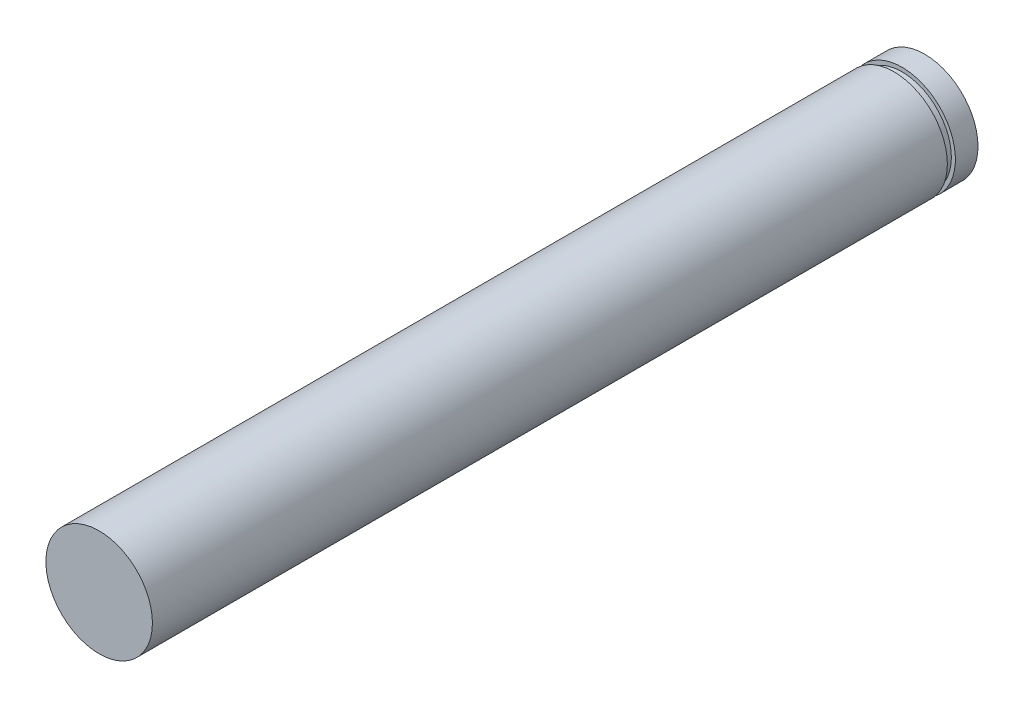
ISO-10303-21;
HEADER;
FILE_DESCRIPTION(('STEP AP214'),'2;1');
FILE_NAME('part.step','',(''),(''),'','','');
FILE_SCHEMA(('AUTOMOTIVE_DESIGN { 1 0 10303 214 1 1 1 1 }'));
ENDSEC;
DATA;
#1=APPLICATION_CONTEXT('core data for automotive mechanical design processes');
#2=APPLICATION_PROTOCOL_DEFINITION('international standard','automotive_design',2000,#1);
#3=PRODUCT_CONTEXT('',#1,'mechanical');
#4=PRODUCT('Part','Part','',(#3));
#5=PRODUCT_RELATED_PRODUCT_CATEGORY('part','',(#4));
#6=PRODUCT_DEFINITION_FORMATION('','',#4);
#7=PRODUCT_DEFINITION_CONTEXT('part definition',#1,'design');
#8=PRODUCT_DEFINITION('design','',#6,#7);
#9=PRODUCT_DEFINITION_SHAPE('','',#8);
#10=(LENGTH_UNIT() NAMED_UNIT(*) SI_UNIT(.MILLI.,.METRE.));
#11=(NAMED_UNIT(*) PLANE_ANGLE_UNIT() SI_UNIT($,.RADIAN.));
#12=(NAMED_UNIT(*) SI_UNIT($,.STERADIAN.) SOLID_ANGLE_UNIT());
#13=UNCERTAINTY_MEASURE_WITH_UNIT(LENGTH_MEASURE(1.E-05),#10,'distance_accuracy_value','');
#14=(GEOMETRIC_REPRESENTATION_CONTEXT(3) GLOBAL_UNCERTAINTY_ASSIGNED_CONTEXT((#13)) GLOBAL_UNIT_ASSIGNED_CONTEXT((#10,
#11,#12)) REPRESENTATION_CONTEXT('',''));
#15=CARTESIAN_POINT('',(0.,0.,0.));
#16=DIRECTION('',(0.,0.,1.));
#17=DIRECTION('',(1.,0.,0.));
#18=AXIS2_PLACEMENT_3D('',#15,#16,#17);
#19=CARTESIAN_POINT('',(0.,0.,62.));
#20=DIRECTION('',(0.,0.,-1.));
#21=DIRECTION('',(-1.,0.,0.));
#22=AXIS2_PLACEMENT_3D('',#19,#20,#21);
#23=CYLINDRICAL_SURFACE('',#22,4.);
#24=CARTESIAN_POINT('',(0.,0.,1.7));
#25=DIRECTION('',(0.,0.,-1.));
#26=DIRECTION('',(-1.,0.,0.));
#27=AXIS2_PLACEMENT_3D('',#24,#25,#26);
#28=CIRCLE('',#27,4.);
#29=CARTESIAN_POINT('',(-4.,0.,1.7));
#30=VERTEX_POINT('',#29);
#31=EDGE_CURVE('E35',#30,#30,#28,.T.);
#32=ORIENTED_EDGE('',*,*,#31,.T.);
#33=EDGE_LOOP('',(#32));
#34=FACE_BOUND('',#33,.T.);
#35=CARTESIAN_POINT('',(0.,0.,0.));
#36=DIRECTION('',(0.,0.,1.));
#37=DIRECTION('',(1.,0.,0.));
#38=AXIS2_PLACEMENT_3D('',#35,#36,#37);
#39=CIRCLE('',#38,4.);
#40=CARTESIAN_POINT('',(4.,0.,0.));
#41=VERTEX_POINT('',#40);
#42=EDGE_CURVE('E39',#41,#41,#39,.T.);
#43=ORIENTED_EDGE('',*,*,#42,.T.);
#44=EDGE_LOOP('',(#43));
#45=FACE_BOUND('',#44,.T.);
#46=ADVANCED_FACE('F31',(#34,#45),#23,.T.);
#47=CARTESIAN_POINT('',(0.,0.,0.));
#48=DIRECTION('',(0.,0.,1.));
#49=DIRECTION('',(1.,0.,0.));
#50=AXIS2_PLACEMENT_3D('',#47,#48,#49);
#51=PLANE('',#50);
#52=ORIENTED_EDGE('',*,*,#42,.F.);
#53=EDGE_LOOP('',(#52));
#54=FACE_BOUND('',#53,.T.);
#55=ADVANCED_FACE('F76',(#54),#51,.F.);
#56=CARTESIAN_POINT('',(3.7,0.,1.7));
#57=DIRECTION('',(0.,0.,-1.));
#58=DIRECTION('',(-1.,0.,0.));
#59=AXIS2_PLACEMENT_3D('',#56,#57,#58);
#60=PLANE('',#59);
#61=CARTESIAN_POINT('',(0.,0.,1.7));
#62=DIRECTION('',(0.,0.,1.));
#63=DIRECTION('',(1.,0.,0.));
#64=AXIS2_PLACEMENT_3D('',#61,#62,#63);
#65=CIRCLE('',#64,3.7);
#66=CARTESIAN_POINT('',(3.7,0.,1.7));
#67=VERTEX_POINT('',#66);
#68=EDGE_CURVE('E46',#67,#67,#65,.T.);
#69=ORIENTED_EDGE('',*,*,#68,.F.);
#70=EDGE_LOOP('',(#69));
#71=FACE_BOUND('',#70,.T.);
#72=ORIENTED_EDGE('',*,*,#31,.F.);
#73=EDGE_LOOP('',(#72));
#74=FACE_BOUND('',#73,.T.);
#75=ADVANCED_FACE('F72',(#71,#74),#60,.F.);
#76=CARTESIAN_POINT('',(3.7,0.,2.3));
#77=DIRECTION('',(0.,0.,1.));
#78=DIRECTION('',(1.,0.,0.));
#79=AXIS2_PLACEMENT_3D('',#76,#77,#78);
#80=PLANE('',#79);
#81=CARTESIAN_POINT('',(0.,0.,2.3));
#82=DIRECTION('',(0.,0.,1.));
#83=DIRECTION('',(1.,0.,0.));
#84=AXIS2_PLACEMENT_3D('',#81,#82,#83);
#85=CIRCLE('',#84,3.7);
#86=CARTESIAN_POINT('',(3.7,0.,2.3));
#87=VERTEX_POINT('',#86);
#88=EDGE_CURVE('E54',#87,#87,#85,.T.);
#89=ORIENTED_EDGE('',*,*,#88,.T.);
#90=EDGE_LOOP('',(#89));
#91=FACE_BOUND('',#90,.T.);
#92=CARTESIAN_POINT('',(0.,0.,2.3));
#93=DIRECTION('',(0.,0.,1.));
#94=DIRECTION('',(1.,0.,0.));
#95=AXIS2_PLACEMENT_3D('',#92,#93,#94);
#96=CIRCLE('',#95,4.);
#97=CARTESIAN_POINT('',(4.,0.,2.3));
#98=VERTEX_POINT('',#97);
#99=EDGE_CURVE('E48',#98,#98,#96,.T.);
#100=ORIENTED_EDGE('',*,*,#99,.F.);
#101=EDGE_LOOP('',(#100));
#102=FACE_BOUND('',#101,.T.);
#103=ADVANCED_FACE('F60',(#91,#102),#80,.F.);
#104=CARTESIAN_POINT('',(0.,0.,62.));
#105=DIRECTION('',(0.,0.,1.));
#106=DIRECTION('',(1.,0.,0.));
#107=AXIS2_PLACEMENT_3D('',#104,#105,#106);
#108=CYLINDRICAL_SURFACE('',#107,3.7);
#109=ORIENTED_EDGE('',*,*,#88,.F.);
#110=EDGE_LOOP('',(#109));
#111=FACE_BOUND('',#110,.T.);
#112=ORIENTED_EDGE('',*,*,#68,.T.);
#113=EDGE_LOOP('',(#112));
#114=FACE_BOUND('',#113,.T.);
#115=ADVANCED_FACE('F63',(#111,#114),#108,.T.);
#116=CARTESIAN_POINT('',(0.,0.,62.));
#117=DIRECTION('',(0.,0.,1.));
#118=DIRECTION('',(1.,0.,0.));
#119=AXIS2_PLACEMENT_3D('',#116,#117,#118);
#120=PLANE('',#119);
#121=CARTESIAN_POINT('',(0.,0.,62.));
#122=DIRECTION('',(0.,0.,1.));
#123=DIRECTION('',(1.,0.,0.));
#124=AXIS2_PLACEMENT_3D('',#121,#122,#123);
#125=CIRCLE('',#124,4.);
#126=CARTESIAN_POINT('',(4.,0.,62.));
#127=VERTEX_POINT('',#126);
#128=EDGE_CURVE('E10',#127,#127,#125,.T.);
#129=ORIENTED_EDGE('',*,*,#128,.T.);
#130=EDGE_LOOP('',(#129));
#131=FACE_BOUND('',#130,.T.);
#132=ADVANCED_FACE('F65',(#131),#120,.T.);
#133=ORIENTED_EDGE('',*,*,#99,.T.);
#134=EDGE_LOOP('',(#133));
#135=FACE_BOUND('',#134,.T.);
#136=ORIENTED_EDGE('',*,*,#128,.F.);
#137=EDGE_LOOP('',(#136));
#138=FACE_BOUND('',#137,.T.);
#139=ADVANCED_FACE('F33',(#135,#138),#23,.T.);
#140=CLOSED_SHELL('',(#46,#55,#75,#103,#115,#132,#139));
#141=MANIFOLD_SOLID_BREP('B2',#140);
#142=ADVANCED_BREP_SHAPE_REPRESENTATION('',(#18,#141),#14);
#143=SHAPE_DEFINITION_REPRESENTATION(#9,#142);
ENDSEC;
END-ISO-10303-21;
